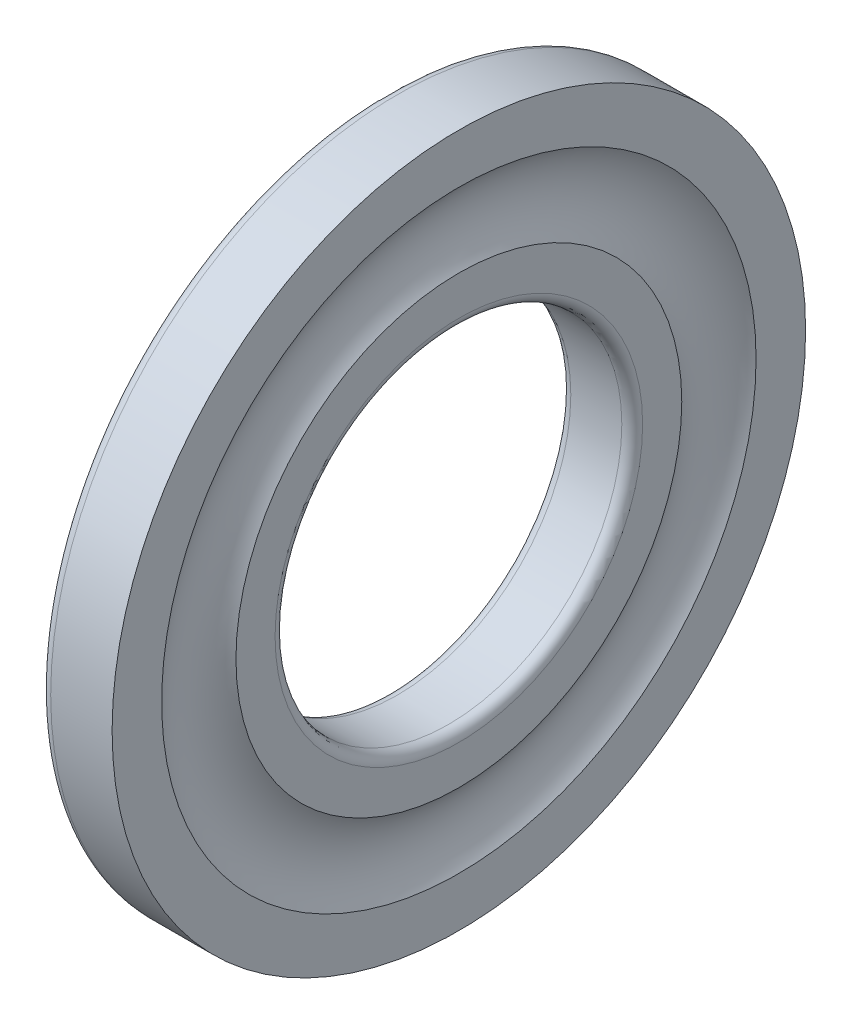
ISO-10303-21;
HEADER;
FILE_DESCRIPTION(('STEP AP214'),'2;1');
FILE_NAME('part.step','',(''),(''),'','','');
FILE_SCHEMA(('AUTOMOTIVE_DESIGN { 1 0 10303 214 1 1 1 1 }'));
ENDSEC;
DATA;
#1=APPLICATION_CONTEXT('core data for automotive mechanical design processes');
#2=APPLICATION_PROTOCOL_DEFINITION('international standard','automotive_design',2000,#1);
#3=PRODUCT_CONTEXT('',#1,'mechanical');
#4=PRODUCT('Part','Part','',(#3));
#5=PRODUCT_RELATED_PRODUCT_CATEGORY('part','',(#4));
#6=PRODUCT_DEFINITION_FORMATION('','',#4);
#7=PRODUCT_DEFINITION_CONTEXT('part definition',#1,'design');
#8=PRODUCT_DEFINITION('design','',#6,#7);
#9=PRODUCT_DEFINITION_SHAPE('','',#8);
#10=(LENGTH_UNIT() NAMED_UNIT(*) SI_UNIT(.MILLI.,.METRE.));
#11=(NAMED_UNIT(*) PLANE_ANGLE_UNIT() SI_UNIT($,.RADIAN.));
#12=(NAMED_UNIT(*) SI_UNIT($,.STERADIAN.) SOLID_ANGLE_UNIT());
#13=UNCERTAINTY_MEASURE_WITH_UNIT(LENGTH_MEASURE(1.E-05),#10,'distance_accuracy_value','');
#14=(GEOMETRIC_REPRESENTATION_CONTEXT(3) GLOBAL_UNCERTAINTY_ASSIGNED_CONTEXT((#13)) GLOBAL_UNIT_ASSIGNED_CONTEXT((#10,
#11,#12)) REPRESENTATION_CONTEXT('',''));
#15=CARTESIAN_POINT('',(0.,0.,0.));
#16=DIRECTION('',(0.,0.,1.));
#17=DIRECTION('',(1.,0.,0.));
#18=AXIS2_PLACEMENT_3D('',#15,#16,#17);
#19=CARTESIAN_POINT('',(0.599999999999877,0.,0.));
#20=DIRECTION('',(1.,0.,0.));
#21=DIRECTION('',(0.,0.,-1.));
#22=AXIS2_PLACEMENT_3D('',#19,#20,#21);
#23=TOROIDAL_SURFACE('',#22,10.5999999999999,0.599999999999877);
#24=CARTESIAN_POINT('',(0.6,0.,0.));
#25=DIRECTION('',(1.,0.,0.));
#26=DIRECTION('',(0.,0.,-1.));
#27=AXIS2_PLACEMENT_3D('',#24,#25,#26);
#28=CIRCLE('',#27,10.);
#29=CARTESIAN_POINT('',(0.6,0.,-10.));
#30=VERTEX_POINT('',#29);
#31=EDGE_CURVE('E10',#30,#30,#28,.T.);
#32=ORIENTED_EDGE('',*,*,#31,.T.);
#33=EDGE_LOOP('',(#32));
#34=FACE_BOUND('',#33,.T.);
#35=CARTESIAN_POINT('',(0.,0.,0.));
#36=DIRECTION('',(1.,0.,0.));
#37=DIRECTION('',(0.,0.,-1.));
#38=AXIS2_PLACEMENT_3D('',#35,#36,#37);
#39=CIRCLE('',#38,10.6);
#40=CARTESIAN_POINT('',(0.,0.,-10.6));
#41=VERTEX_POINT('',#40);
#42=EDGE_CURVE('E61',#41,#41,#39,.T.);
#43=ORIENTED_EDGE('',*,*,#42,.F.);
#44=EDGE_LOOP('',(#43));
#45=FACE_BOUND('',#44,.T.);
#46=ADVANCED_FACE('F30',(#34,#45),#23,.T.);
#47=CARTESIAN_POINT('',(3.542,0.,0.));
#48=DIRECTION('',(1.,0.,0.));
#49=DIRECTION('',(0.,0.,-1.));
#50=AXIS2_PLACEMENT_3D('',#47,#48,#49);
#51=CYLINDRICAL_SURFACE('',#50,10.);
#52=CARTESIAN_POINT('',(3.542,0.,0.));
#53=DIRECTION('',(1.,0.,0.));
#54=DIRECTION('',(0.,0.,-1.));
#55=AXIS2_PLACEMENT_3D('',#52,#53,#54);
#56=CIRCLE('',#55,10.);
#57=CARTESIAN_POINT('',(3.542,0.,-10.));
#58=VERTEX_POINT('',#57);
#59=EDGE_CURVE('E36',#58,#58,#56,.T.);
#60=ORIENTED_EDGE('',*,*,#59,.T.);
#61=EDGE_LOOP('',(#60));
#62=FACE_BOUND('',#61,.T.);
#63=ORIENTED_EDGE('',*,*,#31,.F.);
#64=EDGE_LOOP('',(#63));
#65=FACE_BOUND('',#64,.T.);
#66=ADVANCED_FACE('F69',(#62,#65),#51,.F.);
#67=CARTESIAN_POINT('',(3.54200000000007,0.,0.));
#68=DIRECTION('',(1.,0.,0.));
#69=DIRECTION('',(0.,0.,-1.));
#70=AXIS2_PLACEMENT_3D('',#67,#68,#69);
#71=TOROIDAL_SURFACE('',#70,10.5999999999999,0.599999999999927);
#72=CARTESIAN_POINT('',(4.142,0.,0.));
#73=DIRECTION('',(1.,0.,0.));
#74=DIRECTION('',(0.,0.,-1.));
#75=AXIS2_PLACEMENT_3D('',#72,#73,#74);
#76=CIRCLE('',#75,10.6);
#77=CARTESIAN_POINT('',(4.142,0.,-10.6));
#78=VERTEX_POINT('',#77);
#79=EDGE_CURVE('E40',#78,#78,#76,.T.);
#80=ORIENTED_EDGE('',*,*,#79,.T.);
#81=EDGE_LOOP('',(#80));
#82=FACE_BOUND('',#81,.T.);
#83=ORIENTED_EDGE('',*,*,#59,.F.);
#84=EDGE_LOOP('',(#83));
#85=FACE_BOUND('',#84,.T.);
#86=ADVANCED_FACE('F73',(#82,#85),#71,.T.);
#87=CARTESIAN_POINT('',(4.142,10.6,0.));
#88=DIRECTION('',(1.,0.,0.));
#89=DIRECTION('',(0.,0.,-1.));
#90=AXIS2_PLACEMENT_3D('',#87,#88,#89);
#91=PLANE('',#90);
#92=CARTESIAN_POINT('',(4.142,0.,0.));
#93=DIRECTION('',(1.,0.,0.));
#94=DIRECTION('',(0.,0.,-1.));
#95=AXIS2_PLACEMENT_3D('',#92,#93,#94);
#96=CIRCLE('',#95,12.857333437046);
#97=CARTESIAN_POINT('',(4.142,0.,-12.857333437046));
#98=VERTEX_POINT('',#97);
#99=EDGE_CURVE('E44',#98,#98,#96,.T.);
#100=ORIENTED_EDGE('',*,*,#99,.T.);
#101=EDGE_LOOP('',(#100));
#102=FACE_BOUND('',#101,.T.);
#103=ORIENTED_EDGE('',*,*,#79,.F.);
#104=EDGE_LOOP('',(#103));
#105=FACE_BOUND('',#104,.T.);
#106=ADVANCED_FACE('F77',(#102,#105),#91,.T.);
#107=CARTESIAN_POINT('',(7.00000000000077,0.,0.));
#108=DIRECTION('',(1.,0.,0.));
#109=DIRECTION('',(0.,0.,-1.));
#110=AXIS2_PLACEMENT_3D('',#107,#108,#109);
#111=TOROIDAL_SURFACE('',#110,15.,3.57200000000077);
#112=CARTESIAN_POINT('',(4.142,0.,0.));
#113=DIRECTION('',(1.,0.,0.));
#114=DIRECTION('',(0.,0.,-1.));
#115=AXIS2_PLACEMENT_3D('',#112,#113,#114);
#116=CIRCLE('',#115,17.142666562954);
#117=CARTESIAN_POINT('',(4.142,0.,-17.142666562954));
#118=VERTEX_POINT('',#117);
#119=EDGE_CURVE('E49',#118,#118,#116,.T.);
#120=ORIENTED_EDGE('',*,*,#119,.T.);
#121=EDGE_LOOP('',(#120));
#122=FACE_BOUND('',#121,.T.);
#123=ORIENTED_EDGE('',*,*,#99,.F.);
#124=EDGE_LOOP('',(#123));
#125=FACE_BOUND('',#124,.T.);
#126=ADVANCED_FACE('F84',(#122,#125),#111,.F.);
#127=CARTESIAN_POINT('',(4.142,17.142666562954,0.));
#128=DIRECTION('',(1.,0.,0.));
#129=DIRECTION('',(0.,0.,-1.));
#130=AXIS2_PLACEMENT_3D('',#127,#128,#129);
#131=PLANE('',#130);
#132=CARTESIAN_POINT('',(4.142,0.,0.));
#133=DIRECTION('',(1.,0.,0.));
#134=DIRECTION('',(0.,0.,-1.));
#135=AXIS2_PLACEMENT_3D('',#132,#133,#134);
#136=CIRCLE('',#135,20.);
#137=CARTESIAN_POINT('',(4.142,0.,-20.));
#138=VERTEX_POINT('',#137);
#139=EDGE_CURVE('E52',#138,#138,#136,.T.);
#140=ORIENTED_EDGE('',*,*,#139,.T.);
#141=EDGE_LOOP('',(#140));
#142=FACE_BOUND('',#141,.T.);
#143=ORIENTED_EDGE('',*,*,#119,.F.);
#144=EDGE_LOOP('',(#143));
#145=FACE_BOUND('',#144,.T.);
#146=ADVANCED_FACE('F88',(#142,#145),#131,.T.);
#147=CARTESIAN_POINT('',(3.542,0.,0.));
#148=DIRECTION('',(1.,0.,0.));
#149=DIRECTION('',(0.,0.,-1.));
#150=AXIS2_PLACEMENT_3D('',#147,#148,#149);
#151=CYLINDRICAL_SURFACE('',#150,20.);
#152=CARTESIAN_POINT('',(0.6,0.,0.));
#153=DIRECTION('',(1.,0.,0.));
#154=DIRECTION('',(0.,0.,-1.));
#155=AXIS2_PLACEMENT_3D('',#152,#153,#154);
#156=CIRCLE('',#155,20.);
#157=CARTESIAN_POINT('',(0.6,0.,-20.));
#158=VERTEX_POINT('',#157);
#159=EDGE_CURVE('E55',#158,#158,#156,.T.);
#160=ORIENTED_EDGE('',*,*,#159,.T.);
#161=EDGE_LOOP('',(#160));
#162=FACE_BOUND('',#161,.T.);
#163=ORIENTED_EDGE('',*,*,#139,.F.);
#164=EDGE_LOOP('',(#163));
#165=FACE_BOUND('',#164,.T.);
#166=ADVANCED_FACE('F92',(#162,#165),#151,.T.);
#167=CARTESIAN_POINT('',(0.599999999999877,0.,0.));
#168=DIRECTION('',(1.,0.,0.));
#169=DIRECTION('',(0.,0.,-1.));
#170=AXIS2_PLACEMENT_3D('',#167,#168,#169);
#171=TOROIDAL_SURFACE('',#170,19.4000000000001,0.599999999999876);
#172=CARTESIAN_POINT('',(0.,0.,0.));
#173=DIRECTION('',(1.,0.,0.));
#174=DIRECTION('',(0.,0.,-1.));
#175=AXIS2_PLACEMENT_3D('',#172,#173,#174);
#176=CIRCLE('',#175,19.4);
#177=CARTESIAN_POINT('',(0.,0.,-19.4));
#178=VERTEX_POINT('',#177);
#179=EDGE_CURVE('E58',#178,#178,#176,.T.);
#180=ORIENTED_EDGE('',*,*,#179,.T.);
#181=EDGE_LOOP('',(#180));
#182=FACE_BOUND('',#181,.T.);
#183=ORIENTED_EDGE('',*,*,#159,.F.);
#184=EDGE_LOOP('',(#183));
#185=FACE_BOUND('',#184,.T.);
#186=ADVANCED_FACE('F96',(#182,#185),#171,.T.);
#187=CARTESIAN_POINT('',(0.,19.4,0.));
#188=DIRECTION('',(-1.,0.,0.));
#189=DIRECTION('',(0.,0.,1.));
#190=AXIS2_PLACEMENT_3D('',#187,#188,#189);
#191=PLANE('',#190);
#192=ORIENTED_EDGE('',*,*,#42,.T.);
#193=EDGE_LOOP('',(#192));
#194=FACE_BOUND('',#193,.T.);
#195=ORIENTED_EDGE('',*,*,#179,.F.);
#196=EDGE_LOOP('',(#195));
#197=FACE_BOUND('',#196,.T.);
#198=ADVANCED_FACE('F65',(#194,#197),#191,.T.);
#199=CLOSED_SHELL('',(#46,#66,#86,#106,#126,#146,#166,#186,#198));
#200=MANIFOLD_SOLID_BREP('B2',#199);
#201=ADVANCED_BREP_SHAPE_REPRESENTATION('',(#18,#200),#14);
#202=SHAPE_DEFINITION_REPRESENTATION(#9,#201);
ENDSEC;
END-ISO-10303-21;
